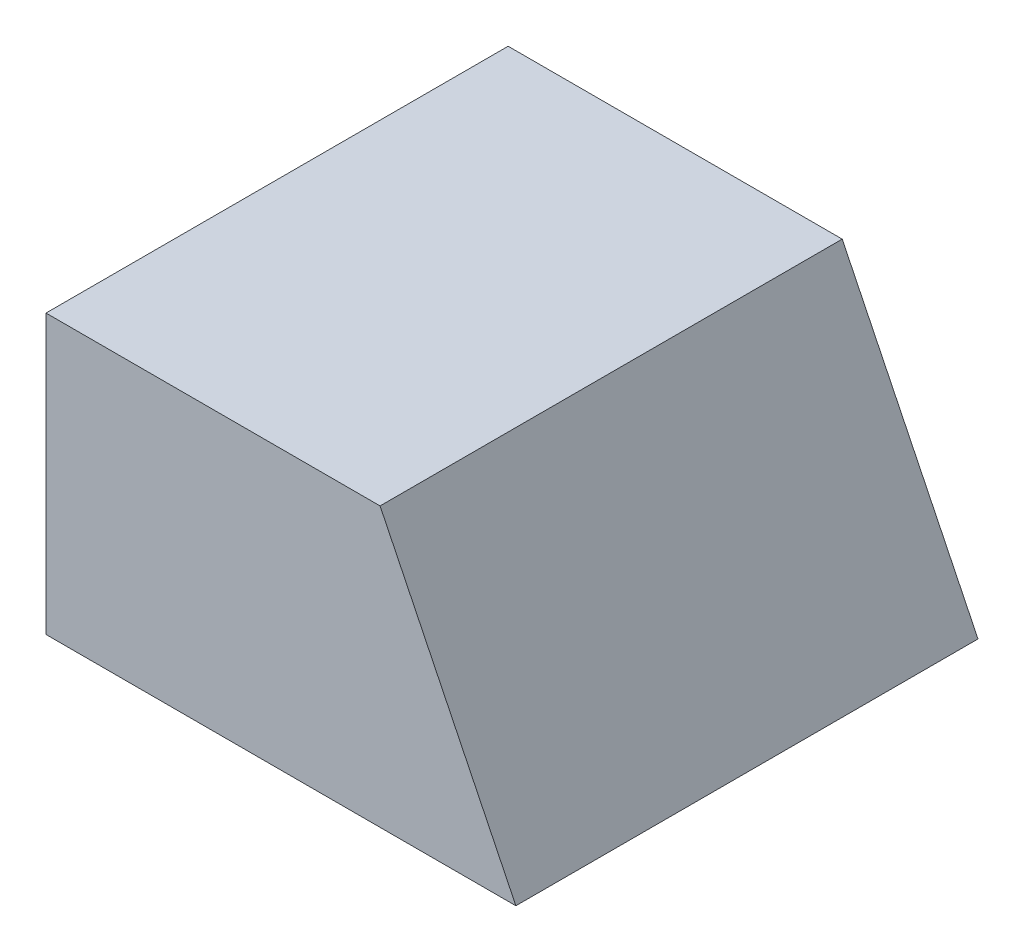
ISO-10303-21;
HEADER;
FILE_DESCRIPTION(('STEP AP214'),'2;1');
FILE_NAME('part.step','',(''),(''),'','','');
FILE_SCHEMA(('AUTOMOTIVE_DESIGN { 1 0 10303 214 1 1 1 1 }'));
ENDSEC;
DATA;
#1=APPLICATION_CONTEXT('core data for automotive mechanical design processes');
#2=APPLICATION_PROTOCOL_DEFINITION('international standard','automotive_design',2000,#1);
#3=PRODUCT_CONTEXT('',#1,'mechanical');
#4=PRODUCT('Part','Part','',(#3));
#5=PRODUCT_RELATED_PRODUCT_CATEGORY('part','',(#4));
#6=PRODUCT_DEFINITION_FORMATION('','',#4);
#7=PRODUCT_DEFINITION_CONTEXT('part definition',#1,'design');
#8=PRODUCT_DEFINITION('design','',#6,#7);
#9=PRODUCT_DEFINITION_SHAPE('','',#8);
#10=(LENGTH_UNIT() NAMED_UNIT(*) SI_UNIT(.MILLI.,.METRE.));
#11=(NAMED_UNIT(*) PLANE_ANGLE_UNIT() SI_UNIT($,.RADIAN.));
#12=(NAMED_UNIT(*) SI_UNIT($,.STERADIAN.) SOLID_ANGLE_UNIT());
#13=UNCERTAINTY_MEASURE_WITH_UNIT(LENGTH_MEASURE(1.E-05),#10,'distance_accuracy_value','');
#14=(GEOMETRIC_REPRESENTATION_CONTEXT(3) GLOBAL_UNCERTAINTY_ASSIGNED_CONTEXT((#13)) GLOBAL_UNIT_ASSIGNED_CONTEXT((#10,
#11,#12)) REPRESENTATION_CONTEXT('',''));
#15=CARTESIAN_POINT('',(0.,0.,0.));
#16=DIRECTION('',(0.,0.,1.));
#17=DIRECTION('',(1.,0.,0.));
#18=AXIS2_PLACEMENT_3D('',#15,#16,#17);
#19=CARTESIAN_POINT('',(-4201.125,-2560.,-4150.));
#20=DIRECTION('',(0.,0.,-1.));
#21=DIRECTION('',(-1.,0.,0.));
#22=AXIS2_PLACEMENT_3D('',#19,#20,#21);
#23=PLANE('',#22);
#24=DIRECTION('',(0.,-1.,0.));
#25=VECTOR('',#24,1.);
#26=CARTESIAN_POINT('',(-8.88178419700125E-13,2500.,-4150.));
#27=LINE('',#26,#25);
#28=CARTESIAN_POINT('',(-8.88178419700125E-13,2500.,-4150.));
#29=VERTEX_POINT('',#28);
#30=CARTESIAN_POINT('',(-8.88178419700125E-13,0.,-4150.));
#31=VERTEX_POINT('',#30);
#32=EDGE_CURVE('E43',#29,#31,#27,.T.);
#33=ORIENTED_EDGE('',*,*,#32,.F.);
#34=DIRECTION('',(-1.,0.,0.));
#35=VECTOR('',#34,1.);
#36=CARTESIAN_POINT('',(-8.88178419700125E-13,2500.,-4150.));
#37=LINE('',#36,#35);
#38=CARTESIAN_POINT('',(3000.,2500.,-4150.));
#39=VERTEX_POINT('',#38);
#40=EDGE_CURVE('E66',#39,#29,#37,.T.);
#41=ORIENTED_EDGE('',*,*,#40,.F.);
#42=DIRECTION('',(-0.438407603705552,0.898776264157635,0.));
#43=VECTOR('',#42,1.);
#44=CARTESIAN_POINT('',(4219.4570027849,0.,-4150.));
#45=LINE('',#44,#43);
#46=CARTESIAN_POINT('',(4219.4570027849,0.,-4150.));
#47=VERTEX_POINT('',#46);
#48=EDGE_CURVE('E71',#47,#39,#45,.T.);
#49=ORIENTED_EDGE('',*,*,#48,.F.);
#50=DIRECTION('',(1.,0.,0.));
#51=VECTOR('',#50,1.);
#52=CARTESIAN_POINT('',(-8.88178419700125E-13,0.,-4150.));
#53=LINE('',#52,#51);
#54=EDGE_CURVE('E86',#31,#47,#53,.T.);
#55=ORIENTED_EDGE('',*,*,#54,.F.);
#56=EDGE_LOOP('',(#33,#41,#49,#55));
#57=FACE_BOUND('',#56,.T.);
#58=ADVANCED_FACE('F35',(#57),#23,.T.);
#59=CARTESIAN_POINT('',(0.,0.,0.));
#60=DIRECTION('',(0.,0.,1.));
#61=DIRECTION('',(1.,0.,0.));
#62=AXIS2_PLACEMENT_3D('',#59,#60,#61);
#63=PLANE('',#62);
#64=DIRECTION('',(0.,-1.,0.));
#65=VECTOR('',#64,1.);
#66=CARTESIAN_POINT('',(-8.88178419700125E-13,2500.,0.));
#67=LINE('',#66,#65);
#68=CARTESIAN_POINT('',(-8.88178419700125E-13,2500.,0.));
#69=VERTEX_POINT('',#68);
#70=CARTESIAN_POINT('',(-8.88178419700125E-13,0.,0.));
#71=VERTEX_POINT('',#70);
#72=EDGE_CURVE('E95',#69,#71,#67,.T.);
#73=ORIENTED_EDGE('',*,*,#72,.T.);
#74=DIRECTION('',(1.,0.,0.));
#75=VECTOR('',#74,1.);
#76=CARTESIAN_POINT('',(-8.88178419700125E-13,0.,0.));
#77=LINE('',#76,#75);
#78=CARTESIAN_POINT('',(4219.4570027849,0.,0.));
#79=VERTEX_POINT('',#78);
#80=EDGE_CURVE('E84',#71,#79,#77,.T.);
#81=ORIENTED_EDGE('',*,*,#80,.T.);
#82=DIRECTION('',(-0.438407603705552,0.898776264157635,0.));
#83=VECTOR('',#82,1.);
#84=CARTESIAN_POINT('',(4219.4570027849,0.,0.));
#85=LINE('',#84,#83);
#86=CARTESIAN_POINT('',(3000.,2500.,0.));
#87=VERTEX_POINT('',#86);
#88=EDGE_CURVE('E87',#79,#87,#85,.T.);
#89=ORIENTED_EDGE('',*,*,#88,.T.);
#90=DIRECTION('',(-1.,0.,0.));
#91=VECTOR('',#90,1.);
#92=CARTESIAN_POINT('',(-8.88178419700125E-13,2500.,0.));
#93=LINE('',#92,#91);
#94=EDGE_CURVE('E92',#87,#69,#93,.T.);
#95=ORIENTED_EDGE('',*,*,#94,.T.);
#96=EDGE_LOOP('',(#73,#81,#89,#95));
#97=FACE_BOUND('',#96,.T.);
#98=ADVANCED_FACE('F94',(#97),#63,.T.);
#99=CARTESIAN_POINT('',(-8.88178419700125E-13,0.,-9054.46912502776));
#100=DIRECTION('',(0.,-1.,0.));
#101=DIRECTION('',(0.,0.,-1.));
#102=AXIS2_PLACEMENT_3D('',#99,#100,#101);
#103=PLANE('',#102);
#104=DIRECTION('',(0.,0.,1.));
#105=VECTOR('',#104,1.);
#106=CARTESIAN_POINT('',(-8.88178419700125E-13,0.,-9054.46912502776));
#107=LINE('',#106,#105);
#108=EDGE_CURVE('E11',#31,#71,#107,.T.);
#109=ORIENTED_EDGE('',*,*,#108,.F.);
#110=ORIENTED_EDGE('',*,*,#54,.T.);
#111=DIRECTION('',(0.,0.,1.));
#112=VECTOR('',#111,1.);
#113=CARTESIAN_POINT('',(4219.4570027849,0.,-9054.46912502776));
#114=LINE('',#113,#112);
#115=EDGE_CURVE('E81',#47,#79,#114,.T.);
#116=ORIENTED_EDGE('',*,*,#115,.T.);
#117=ORIENTED_EDGE('',*,*,#80,.F.);
#118=EDGE_LOOP('',(#109,#110,#116,#117));
#119=FACE_BOUND('',#118,.T.);
#120=ADVANCED_FACE('F82',(#119),#103,.T.);
#121=CARTESIAN_POINT('',(4219.4570027849,0.,-9054.46912502776));
#122=DIRECTION('',(0.898776264157635,0.438407603705552,0.));
#123=DIRECTION('',(-0.438407603705552,0.898776264157635,0.));
#124=AXIS2_PLACEMENT_3D('',#121,#122,#123);
#125=PLANE('',#124);
#126=ORIENTED_EDGE('',*,*,#115,.F.);
#127=ORIENTED_EDGE('',*,*,#48,.T.);
#128=DIRECTION('',(0.,0.,1.));
#129=VECTOR('',#128,1.);
#130=CARTESIAN_POINT('',(3000.,2500.,-9054.46912502776));
#131=LINE('',#130,#129);
#132=EDGE_CURVE('E76',#39,#87,#131,.T.);
#133=ORIENTED_EDGE('',*,*,#132,.T.);
#134=ORIENTED_EDGE('',*,*,#88,.F.);
#135=EDGE_LOOP('',(#126,#127,#133,#134));
#136=FACE_BOUND('',#135,.T.);
#137=ADVANCED_FACE('F88',(#136),#125,.T.);
#138=CARTESIAN_POINT('',(-8.88178419700125E-13,2500.,-9054.46912502776));
#139=DIRECTION('',(0.,1.,0.));
#140=DIRECTION('',(0.,0.,1.));
#141=AXIS2_PLACEMENT_3D('',#138,#139,#140);
#142=PLANE('',#141);
#143=ORIENTED_EDGE('',*,*,#132,.F.);
#144=ORIENTED_EDGE('',*,*,#40,.T.);
#145=DIRECTION('',(0.,0.,1.));
#146=VECTOR('',#145,1.);
#147=CARTESIAN_POINT('',(-8.88178419700125E-13,2500.,-9054.46912502776));
#148=LINE('',#147,#146);
#149=EDGE_CURVE('E102',#29,#69,#148,.T.);
#150=ORIENTED_EDGE('',*,*,#149,.T.);
#151=ORIENTED_EDGE('',*,*,#94,.F.);
#152=EDGE_LOOP('',(#143,#144,#150,#151));
#153=FACE_BOUND('',#152,.T.);
#154=ADVANCED_FACE('F108',(#153),#142,.T.);
#155=CARTESIAN_POINT('',(-8.88178419700125E-13,2500.,-9054.46912502776));
#156=DIRECTION('',(-1.,0.,0.));
#157=DIRECTION('',(0.,0.,1.));
#158=AXIS2_PLACEMENT_3D('',#155,#156,#157);
#159=PLANE('',#158);
#160=ORIENTED_EDGE('',*,*,#149,.F.);
#161=ORIENTED_EDGE('',*,*,#32,.T.);
#162=ORIENTED_EDGE('',*,*,#108,.T.);
#163=ORIENTED_EDGE('',*,*,#72,.F.);
#164=EDGE_LOOP('',(#160,#161,#162,#163));
#165=FACE_BOUND('',#164,.T.);
#166=ADVANCED_FACE('F109',(#165),#159,.T.);
#167=CLOSED_SHELL('',(#58,#98,#120,#137,#154,#166));
#168=MANIFOLD_SOLID_BREP('B2',#167);
#169=ADVANCED_BREP_SHAPE_REPRESENTATION('',(#18,#168),#14);
#170=SHAPE_DEFINITION_REPRESENTATION(#9,#169);
ENDSEC;
END-ISO-10303-21;
